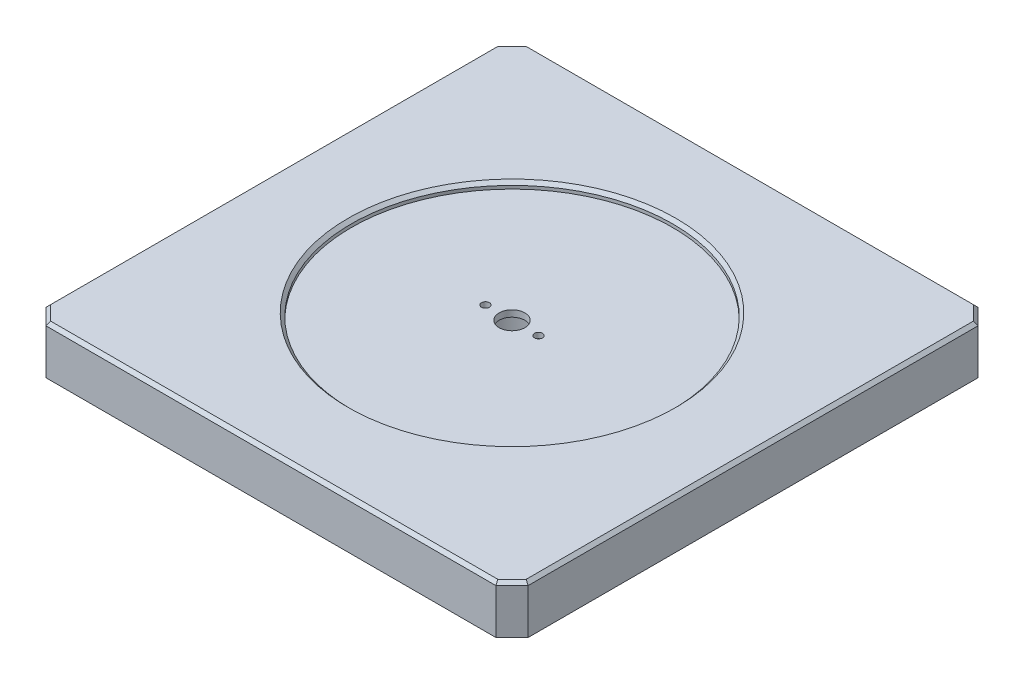
ISO-10303-21;
HEADER;
FILE_DESCRIPTION(('STEP AP214'),'2;1');
FILE_NAME('part.step','',(''),(''),'','','');
FILE_SCHEMA(('AUTOMOTIVE_DESIGN { 1 0 10303 214 1 1 1 1 }'));
ENDSEC;
DATA;
#1=APPLICATION_CONTEXT('core data for automotive mechanical design processes');
#2=APPLICATION_PROTOCOL_DEFINITION('international standard','automotive_design',2000,#1);
#3=PRODUCT_CONTEXT('',#1,'mechanical');
#4=PRODUCT('Part','Part','',(#3));
#5=PRODUCT_RELATED_PRODUCT_CATEGORY('part','',(#4));
#6=PRODUCT_DEFINITION_FORMATION('','',#4);
#7=PRODUCT_DEFINITION_CONTEXT('part definition',#1,'design');
#8=PRODUCT_DEFINITION('design','',#6,#7);
#9=PRODUCT_DEFINITION_SHAPE('','',#8);
#10=(LENGTH_UNIT() NAMED_UNIT(*) SI_UNIT(.MILLI.,.METRE.));
#11=(NAMED_UNIT(*) PLANE_ANGLE_UNIT() SI_UNIT($,.RADIAN.));
#12=(NAMED_UNIT(*) SI_UNIT($,.STERADIAN.) SOLID_ANGLE_UNIT());
#13=UNCERTAINTY_MEASURE_WITH_UNIT(LENGTH_MEASURE(1.E-05),#10,'distance_accuracy_value','');
#14=(GEOMETRIC_REPRESENTATION_CONTEXT(3) GLOBAL_UNCERTAINTY_ASSIGNED_CONTEXT((#13)) GLOBAL_UNIT_ASSIGNED_CONTEXT((#10,
#11,#12)) REPRESENTATION_CONTEXT('',''));
#15=CARTESIAN_POINT('',(0.,0.,0.));
#16=DIRECTION('',(0.,0.,1.));
#17=DIRECTION('',(1.,0.,0.));
#18=AXIS2_PLACEMENT_3D('',#15,#16,#17);
#19=CARTESIAN_POINT('',(0.,15.,0.));
#20=DIRECTION('',(0.,-1.,0.));
#21=DIRECTION('',(0.,0.,-1.));
#22=AXIS2_PLACEMENT_3D('',#19,#20,#21);
#23=CYLINDRICAL_SURFACE('',#22,4.);
#24=CARTESIAN_POINT('',(0.,11.,0.));
#25=DIRECTION('',(0.,-1.,0.));
#26=DIRECTION('',(0.,0.,-1.));
#27=AXIS2_PLACEMENT_3D('',#24,#25,#26);
#28=CIRCLE('',#27,4.);
#29=CARTESIAN_POINT('',(0.,11.,-4.));
#30=VERTEX_POINT('',#29);
#31=EDGE_CURVE('E165',#30,#30,#28,.T.);
#32=ORIENTED_EDGE('',*,*,#31,.T.);
#33=EDGE_LOOP('',(#32));
#34=FACE_BOUND('',#33,.T.);
#35=CARTESIAN_POINT('',(0.,13.,0.));
#36=DIRECTION('',(0.,1.,0.));
#37=DIRECTION('',(0.,0.,1.));
#38=AXIS2_PLACEMENT_3D('',#35,#36,#37);
#39=CIRCLE('',#38,4.);
#40=CARTESIAN_POINT('',(0.,13.,4.));
#41=VERTEX_POINT('',#40);
#42=EDGE_CURVE('E162',#41,#41,#39,.F.);
#43=ORIENTED_EDGE('',*,*,#42,.F.);
#44=EDGE_LOOP('',(#43));
#45=FACE_BOUND('',#44,.T.);
#46=ADVANCED_FACE('F36',(#34,#45),#23,.F.);
#47=CARTESIAN_POINT('',(75.,15.,-75.));
#48=DIRECTION('',(-1.,0.,0.));
#49=DIRECTION('',(0.,0.,1.));
#50=AXIS2_PLACEMENT_3D('',#47,#48,#49);
#51=PLANE('',#50);
#52=DIRECTION('',(0.,1.,0.));
#53=VECTOR('',#52,1.);
#54=CARTESIAN_POINT('',(75.,15.,-70.));
#55=LINE('',#54,#53);
#56=CARTESIAN_POINT('',(75.,0.,-70.));
#57=VERTEX_POINT('',#56);
#58=CARTESIAN_POINT('',(75.,14.0000000000001,-70.));
#59=VERTEX_POINT('',#58);
#60=EDGE_CURVE('E139',#57,#59,#55,.T.);
#61=ORIENTED_EDGE('',*,*,#60,.T.);
#62=DIRECTION('',(0.,0.,1.));
#63=VECTOR('',#62,1.);
#64=CARTESIAN_POINT('',(75.,14.0000000000001,-75.));
#65=LINE('',#64,#63);
#66=CARTESIAN_POINT('',(75.,14.0000000000001,70.));
#67=VERTEX_POINT('',#66);
#68=EDGE_CURVE('E45',#59,#67,#65,.T.);
#69=ORIENTED_EDGE('',*,*,#68,.T.);
#70=DIRECTION('',(0.,-1.,0.));
#71=VECTOR('',#70,1.);
#72=CARTESIAN_POINT('',(75.,15.,70.));
#73=LINE('',#72,#71);
#74=CARTESIAN_POINT('',(75.,0.,70.));
#75=VERTEX_POINT('',#74);
#76=EDGE_CURVE('E143',#67,#75,#73,.T.);
#77=ORIENTED_EDGE('',*,*,#76,.T.);
#78=DIRECTION('',(0.,0.,-1.));
#79=VECTOR('',#78,1.);
#80=CARTESIAN_POINT('',(75.,0.,-75.));
#81=LINE('',#80,#79);
#82=EDGE_CURVE('E150',#75,#57,#81,.T.);
#83=ORIENTED_EDGE('',*,*,#82,.T.);
#84=EDGE_LOOP('',(#61,#69,#77,#83));
#85=FACE_BOUND('',#84,.T.);
#86=ADVANCED_FACE('F295',(#85),#51,.F.);
#87=CARTESIAN_POINT('',(75.,15.,-75.));
#88=DIRECTION('',(0.,0.,1.));
#89=DIRECTION('',(1.,0.,0.));
#90=AXIS2_PLACEMENT_3D('',#87,#88,#89);
#91=PLANE('',#90);
#92=DIRECTION('',(0.,1.,0.));
#93=VECTOR('',#92,1.);
#94=CARTESIAN_POINT('',(-70.,15.,-75.));
#95=LINE('',#94,#93);
#96=CARTESIAN_POINT('',(-70.,0.,-75.));
#97=VERTEX_POINT('',#96);
#98=CARTESIAN_POINT('',(-70.,14.0000000000001,-75.));
#99=VERTEX_POINT('',#98);
#100=EDGE_CURVE('E135',#97,#99,#95,.T.);
#101=ORIENTED_EDGE('',*,*,#100,.T.);
#102=DIRECTION('',(1.,0.,0.));
#103=VECTOR('',#102,1.);
#104=CARTESIAN_POINT('',(75.,14.0000000000001,-75.));
#105=LINE('',#104,#103);
#106=CARTESIAN_POINT('',(70.,14.0000000000001,-75.));
#107=VERTEX_POINT('',#106);
#108=EDGE_CURVE('E61',#99,#107,#105,.T.);
#109=ORIENTED_EDGE('',*,*,#108,.T.);
#110=DIRECTION('',(0.,-1.,0.));
#111=VECTOR('',#110,1.);
#112=CARTESIAN_POINT('',(70.,15.,-75.));
#113=LINE('',#112,#111);
#114=CARTESIAN_POINT('',(70.,0.,-75.));
#115=VERTEX_POINT('',#114);
#116=EDGE_CURVE('E127',#107,#115,#113,.T.);
#117=ORIENTED_EDGE('',*,*,#116,.T.);
#118=DIRECTION('',(-1.,0.,0.));
#119=VECTOR('',#118,1.);
#120=CARTESIAN_POINT('',(75.,0.,-75.));
#121=LINE('',#120,#119);
#122=EDGE_CURVE('E131',#115,#97,#121,.T.);
#123=ORIENTED_EDGE('',*,*,#122,.T.);
#124=EDGE_LOOP('',(#101,#109,#117,#123));
#125=FACE_BOUND('',#124,.T.);
#126=ADVANCED_FACE('F129',(#125),#91,.F.);
#127=CARTESIAN_POINT('',(-75.,15.,-75.));
#128=DIRECTION('',(1.,0.,0.));
#129=DIRECTION('',(0.,0.,-1.));
#130=AXIS2_PLACEMENT_3D('',#127,#128,#129);
#131=PLANE('',#130);
#132=DIRECTION('',(0.,1.,0.));
#133=VECTOR('',#132,1.);
#134=CARTESIAN_POINT('',(-75.,15.,70.));
#135=LINE('',#134,#133);
#136=CARTESIAN_POINT('',(-75.,0.,70.));
#137=VERTEX_POINT('',#136);
#138=CARTESIAN_POINT('',(-75.,14.0000000000001,70.));
#139=VERTEX_POINT('',#138);
#140=EDGE_CURVE('E191',#137,#139,#135,.T.);
#141=ORIENTED_EDGE('',*,*,#140,.T.);
#142=DIRECTION('',(0.,0.,-1.));
#143=VECTOR('',#142,1.);
#144=CARTESIAN_POINT('',(-75.,14.0000000000001,-75.));
#145=LINE('',#144,#143);
#146=CARTESIAN_POINT('',(-75.,14.0000000000001,-70.));
#147=VERTEX_POINT('',#146);
#148=EDGE_CURVE('E221',#139,#147,#145,.T.);
#149=ORIENTED_EDGE('',*,*,#148,.T.);
#150=DIRECTION('',(0.,-1.,0.));
#151=VECTOR('',#150,1.);
#152=CARTESIAN_POINT('',(-75.,15.,-70.));
#153=LINE('',#152,#151);
#154=CARTESIAN_POINT('',(-75.,0.,-70.));
#155=VERTEX_POINT('',#154);
#156=EDGE_CURVE('E189',#147,#155,#153,.T.);
#157=ORIENTED_EDGE('',*,*,#156,.T.);
#158=DIRECTION('',(0.,0.,1.));
#159=VECTOR('',#158,1.);
#160=CARTESIAN_POINT('',(-75.,0.,-75.));
#161=LINE('',#160,#159);
#162=EDGE_CURVE('E149',#155,#137,#161,.T.);
#163=ORIENTED_EDGE('',*,*,#162,.T.);
#164=EDGE_LOOP('',(#141,#149,#157,#163));
#165=FACE_BOUND('',#164,.T.);
#166=ADVANCED_FACE('F419',(#165),#131,.F.);
#167=CARTESIAN_POINT('',(75.,15.,75.));
#168=DIRECTION('',(0.,0.,-1.));
#169=DIRECTION('',(-1.,0.,0.));
#170=AXIS2_PLACEMENT_3D('',#167,#168,#169);
#171=PLANE('',#170);
#172=DIRECTION('',(0.,1.,0.));
#173=VECTOR('',#172,1.);
#174=CARTESIAN_POINT('',(70.,15.,75.));
#175=LINE('',#174,#173);
#176=CARTESIAN_POINT('',(70.,0.,75.));
#177=VERTEX_POINT('',#176);
#178=CARTESIAN_POINT('',(70.,14.0000000000001,75.));
#179=VERTEX_POINT('',#178);
#180=EDGE_CURVE('E186',#177,#179,#175,.T.);
#181=ORIENTED_EDGE('',*,*,#180,.T.);
#182=DIRECTION('',(-1.,0.,0.));
#183=VECTOR('',#182,1.);
#184=CARTESIAN_POINT('',(75.,14.0000000000001,75.));
#185=LINE('',#184,#183);
#186=CARTESIAN_POINT('',(-70.,14.0000000000001,75.));
#187=VERTEX_POINT('',#186);
#188=EDGE_CURVE('E217',#179,#187,#185,.T.);
#189=ORIENTED_EDGE('',*,*,#188,.T.);
#190=DIRECTION('',(0.,-1.,0.));
#191=VECTOR('',#190,1.);
#192=CARTESIAN_POINT('',(-70.,15.,75.));
#193=LINE('',#192,#191);
#194=CARTESIAN_POINT('',(-70.,0.,75.));
#195=VERTEX_POINT('',#194);
#196=EDGE_CURVE('E184',#187,#195,#193,.T.);
#197=ORIENTED_EDGE('',*,*,#196,.T.);
#198=DIRECTION('',(1.,0.,0.));
#199=VECTOR('',#198,1.);
#200=CARTESIAN_POINT('',(75.,0.,75.));
#201=LINE('',#200,#199);
#202=EDGE_CURVE('E153',#195,#177,#201,.T.);
#203=ORIENTED_EDGE('',*,*,#202,.T.);
#204=EDGE_LOOP('',(#181,#189,#197,#203));
#205=FACE_BOUND('',#204,.T.);
#206=ADVANCED_FACE('F290',(#205),#171,.F.);
#207=CARTESIAN_POINT('',(0.,15.,0.));
#208=DIRECTION('',(0.,-1.,0.));
#209=DIRECTION('',(0.,0.,-1.));
#210=AXIS2_PLACEMENT_3D('',#207,#208,#209);
#211=PLANE('',#210);
#212=DIRECTION('',(1.,0.,0.));
#213=VECTOR('',#212,1.);
#214=CARTESIAN_POINT('',(0.,15.,74.));
#215=LINE('',#214,#213);
#216=CARTESIAN_POINT('',(-69.5857864376269,15.,74.));
#217=VERTEX_POINT('',#216);
#218=CARTESIAN_POINT('',(69.5857864376269,15.,74.));
#219=VERTEX_POINT('',#218);
#220=EDGE_CURVE('E209',#217,#219,#215,.T.);
#221=ORIENTED_EDGE('',*,*,#220,.T.);
#222=DIRECTION('',(0.707106781186548,0.,-0.707106781186548));
#223=VECTOR('',#222,1.);
#224=CARTESIAN_POINT('',(74.2928932188135,15.,69.2928932188134));
#225=LINE('',#224,#223);
#226=CARTESIAN_POINT('',(74.0000000000001,15.,69.5857864376269));
#227=VERTEX_POINT('',#226);
#228=EDGE_CURVE('E211',#219,#227,#225,.T.);
#229=ORIENTED_EDGE('',*,*,#228,.T.);
#230=DIRECTION('',(0.,0.,-1.));
#231=VECTOR('',#230,1.);
#232=CARTESIAN_POINT('',(74.0000000000001,15.,0.));
#233=LINE('',#232,#231);
#234=CARTESIAN_POINT('',(74.0000000000001,15.,-69.5857864376269));
#235=VERTEX_POINT('',#234);
#236=EDGE_CURVE('E197',#227,#235,#233,.T.);
#237=ORIENTED_EDGE('',*,*,#236,.T.);
#238=DIRECTION('',(-0.707106781186546,0.,-0.707106781186549));
#239=VECTOR('',#238,1.);
#240=CARTESIAN_POINT('',(69.2928932188135,15.,-74.2928932188135));
#241=LINE('',#240,#239);
#242=CARTESIAN_POINT('',(69.5857864376269,15.,-74.));
#243=VERTEX_POINT('',#242);
#244=EDGE_CURVE('E199',#235,#243,#241,.T.);
#245=ORIENTED_EDGE('',*,*,#244,.T.);
#246=DIRECTION('',(-1.,0.,0.));
#247=VECTOR('',#246,1.);
#248=CARTESIAN_POINT('',(0.,15.,-74.));
#249=LINE('',#248,#247);
#250=CARTESIAN_POINT('',(-69.5857864376269,15.,-74.));
#251=VERTEX_POINT('',#250);
#252=EDGE_CURVE('E201',#243,#251,#249,.T.);
#253=ORIENTED_EDGE('',*,*,#252,.T.);
#254=DIRECTION('',(-0.707106781186549,0.,0.707106781186546));
#255=VECTOR('',#254,1.);
#256=CARTESIAN_POINT('',(-74.2928932188135,15.,-69.2928932188135));
#257=LINE('',#256,#255);
#258=CARTESIAN_POINT('',(-74.,15.,-69.5857864376269));
#259=VERTEX_POINT('',#258);
#260=EDGE_CURVE('E203',#251,#259,#257,.T.);
#261=ORIENTED_EDGE('',*,*,#260,.T.);
#262=DIRECTION('',(0.,0.,1.));
#263=VECTOR('',#262,1.);
#264=CARTESIAN_POINT('',(-74.,15.,0.));
#265=LINE('',#264,#263);
#266=CARTESIAN_POINT('',(-74.,15.,69.5857864376269));
#267=VERTEX_POINT('',#266);
#268=EDGE_CURVE('E205',#259,#267,#265,.T.);
#269=ORIENTED_EDGE('',*,*,#268,.T.);
#270=DIRECTION('',(0.707106781186549,0.,0.707106781186546));
#271=VECTOR('',#270,1.);
#272=CARTESIAN_POINT('',(-69.2928932188135,15.,74.2928932188134));
#273=LINE('',#272,#271);
#274=EDGE_CURVE('E207',#267,#217,#273,.T.);
#275=ORIENTED_EDGE('',*,*,#274,.T.);
#276=EDGE_LOOP('',(#221,#229,#237,#245,#253,#261,#269,#275));
#277=FACE_BOUND('',#276,.T.);
#278=CARTESIAN_POINT('',(0.,15.,0.));
#279=DIRECTION('',(0.,-1.,0.));
#280=DIRECTION('',(0.,0.,-1.));
#281=AXIS2_PLACEMENT_3D('',#278,#279,#280);
#282=CIRCLE('',#281,51.);
#283=CARTESIAN_POINT('',(0.,15.,-51.));
#284=VERTEX_POINT('',#283);
#285=EDGE_CURVE('E194',#284,#284,#282,.T.);
#286=ORIENTED_EDGE('',*,*,#285,.T.);
#287=EDGE_LOOP('',(#286));
#288=FACE_BOUND('',#287,.T.);
#289=ADVANCED_FACE('F281',(#277,#288),#211,.F.);
#290=CARTESIAN_POINT('',(0.,0.,0.));
#291=DIRECTION('',(0.,-1.,0.));
#292=DIRECTION('',(0.,0.,-1.));
#293=AXIS2_PLACEMENT_3D('',#290,#291,#292);
#294=PLANE('',#293);
#295=CARTESIAN_POINT('',(0.,0.,0.));
#296=DIRECTION('',(0.,-1.,0.));
#297=DIRECTION('',(0.,0.,-1.));
#298=AXIS2_PLACEMENT_3D('',#295,#296,#297);
#299=CIRCLE('',#298,12.5);
#300=CARTESIAN_POINT('',(0.,0.,-12.5));
#301=VERTEX_POINT('',#300);
#302=EDGE_CURVE('E271',#301,#301,#299,.T.);
#303=ORIENTED_EDGE('',*,*,#302,.F.);
#304=EDGE_LOOP('',(#303));
#305=FACE_BOUND('',#304,.T.);
#306=ORIENTED_EDGE('',*,*,#122,.F.);
#307=DIRECTION('',(-0.707106781186546,0.,-0.707106781186549));
#308=VECTOR('',#307,1.);
#309=CARTESIAN_POINT('',(72.5000000000002,0.,-72.4999999999998));
#310=LINE('',#309,#308);
#311=EDGE_CURVE('E137',#115,#57,#310,.F.);
#312=ORIENTED_EDGE('',*,*,#311,.T.);
#313=ORIENTED_EDGE('',*,*,#82,.F.);
#314=DIRECTION('',(0.707106781186548,0.,-0.707106781186548));
#315=VECTOR('',#314,1.);
#316=CARTESIAN_POINT('',(72.5,0.,72.5));
#317=LINE('',#316,#315);
#318=EDGE_CURVE('E144',#75,#177,#317,.F.);
#319=ORIENTED_EDGE('',*,*,#318,.T.);
#320=ORIENTED_EDGE('',*,*,#202,.F.);
#321=DIRECTION('',(0.707106781186549,0.,0.707106781186546));
#322=VECTOR('',#321,1.);
#323=CARTESIAN_POINT('',(-72.4999999999998,0.,72.5000000000002));
#324=LINE('',#323,#322);
#325=EDGE_CURVE('E179',#195,#137,#324,.F.);
#326=ORIENTED_EDGE('',*,*,#325,.T.);
#327=ORIENTED_EDGE('',*,*,#162,.F.);
#328=DIRECTION('',(-0.707106781186549,0.,0.707106781186546));
#329=VECTOR('',#328,1.);
#330=CARTESIAN_POINT('',(-72.4999999999998,0.,-72.5000000000002));
#331=LINE('',#330,#329);
#332=EDGE_CURVE('E134',#155,#97,#331,.F.);
#333=ORIENTED_EDGE('',*,*,#332,.T.);
#334=EDGE_LOOP('',(#306,#312,#313,#319,#320,#326,#327,#333));
#335=FACE_BOUND('',#334,.T.);
#336=ADVANCED_FACE('F146',(#305,#335),#294,.T.);
#337=CARTESIAN_POINT('',(0.,11.,0.));
#338=DIRECTION('',(0.,-1.,0.));
#339=DIRECTION('',(0.,0.,-1.));
#340=AXIS2_PLACEMENT_3D('',#337,#338,#339);
#341=CYLINDRICAL_SURFACE('',#340,12.5);
#342=CARTESIAN_POINT('',(0.,11.,0.));
#343=DIRECTION('',(0.,-1.,0.));
#344=DIRECTION('',(0.,0.,-1.));
#345=AXIS2_PLACEMENT_3D('',#342,#343,#344);
#346=CIRCLE('',#345,12.5);
#347=CARTESIAN_POINT('',(0.,11.,-12.5));
#348=VERTEX_POINT('',#347);
#349=EDGE_CURVE('E155',#348,#348,#346,.T.);
#350=ORIENTED_EDGE('',*,*,#349,.F.);
#351=EDGE_LOOP('',(#350));
#352=FACE_BOUND('',#351,.T.);
#353=ORIENTED_EDGE('',*,*,#302,.T.);
#354=EDGE_LOOP('',(#353));
#355=FACE_BOUND('',#354,.T.);
#356=ADVANCED_FACE('F278',(#352,#355),#341,.F.);
#357=CARTESIAN_POINT('',(0.,11.,0.));
#358=DIRECTION('',(0.,-1.,0.));
#359=DIRECTION('',(0.,0.,-1.));
#360=AXIS2_PLACEMENT_3D('',#357,#358,#359);
#361=PLANE('',#360);
#362=CARTESIAN_POINT('',(8.25,11.,0.));
#363=DIRECTION('',(0.,-1.,0.));
#364=DIRECTION('',(0.,0.,-1.));
#365=AXIS2_PLACEMENT_3D('',#362,#363,#364);
#366=CIRCLE('',#365,1.525);
#367=CARTESIAN_POINT('',(8.25,11.,-1.525));
#368=VERTEX_POINT('',#367);
#369=EDGE_CURVE('E249',#368,#368,#366,.T.);
#370=ORIENTED_EDGE('',*,*,#369,.F.);
#371=EDGE_LOOP('',(#370));
#372=FACE_BOUND('',#371,.T.);
#373=CARTESIAN_POINT('',(-8.25,11.,0.));
#374=DIRECTION('',(0.,-1.,0.));
#375=DIRECTION('',(0.,0.,-1.));
#376=AXIS2_PLACEMENT_3D('',#373,#374,#375);
#377=CIRCLE('',#376,1.525);
#378=CARTESIAN_POINT('',(-8.25,11.,-1.525));
#379=VERTEX_POINT('',#378);
#380=EDGE_CURVE('E175',#379,#379,#377,.T.);
#381=ORIENTED_EDGE('',*,*,#380,.F.);
#382=EDGE_LOOP('',(#381));
#383=FACE_BOUND('',#382,.T.);
#384=ORIENTED_EDGE('',*,*,#31,.F.);
#385=EDGE_LOOP('',(#384));
#386=FACE_BOUND('',#385,.T.);
#387=ORIENTED_EDGE('',*,*,#349,.T.);
#388=EDGE_LOOP('',(#387));
#389=FACE_BOUND('',#388,.T.);
#390=ADVANCED_FACE('F287',(#372,#383,#386,#389),#361,.T.);
#391=CARTESIAN_POINT('',(0.,13.,0.));
#392=DIRECTION('',(0.,1.,0.));
#393=DIRECTION('',(0.,0.,1.));
#394=AXIS2_PLACEMENT_3D('',#391,#392,#393);
#395=PLANE('',#394);
#396=CARTESIAN_POINT('',(8.25,13.,0.));
#397=DIRECTION('',(0.,1.,0.));
#398=DIRECTION('',(0.,0.,1.));
#399=AXIS2_PLACEMENT_3D('',#396,#397,#398);
#400=CIRCLE('',#399,1.25);
#401=CARTESIAN_POINT('',(8.25,13.,1.25));
#402=VERTEX_POINT('',#401);
#403=EDGE_CURVE('E172',#402,#402,#400,.T.);
#404=ORIENTED_EDGE('',*,*,#403,.F.);
#405=EDGE_LOOP('',(#404));
#406=FACE_BOUND('',#405,.T.);
#407=CARTESIAN_POINT('',(-8.25,13.,0.));
#408=DIRECTION('',(0.,1.,0.));
#409=DIRECTION('',(0.,0.,1.));
#410=AXIS2_PLACEMENT_3D('',#407,#408,#409);
#411=CIRCLE('',#410,1.25);
#412=CARTESIAN_POINT('',(-8.25,13.,1.25));
#413=VERTEX_POINT('',#412);
#414=EDGE_CURVE('E167',#413,#413,#411,.T.);
#415=ORIENTED_EDGE('',*,*,#414,.F.);
#416=EDGE_LOOP('',(#415));
#417=FACE_BOUND('',#416,.T.);
#418=CARTESIAN_POINT('',(0.,13.,0.));
#419=DIRECTION('',(0.,1.,0.));
#420=DIRECTION('',(0.,0.,1.));
#421=AXIS2_PLACEMENT_3D('',#418,#419,#420);
#422=CIRCLE('',#421,50.);
#423=CARTESIAN_POINT('',(0.,13.,50.));
#424=VERTEX_POINT('',#423);
#425=EDGE_CURVE('E166',#424,#424,#422,.T.);
#426=ORIENTED_EDGE('',*,*,#425,.T.);
#427=EDGE_LOOP('',(#426));
#428=FACE_BOUND('',#427,.T.);
#429=ORIENTED_EDGE('',*,*,#42,.T.);
#430=EDGE_LOOP('',(#429));
#431=FACE_BOUND('',#430,.T.);
#432=ADVANCED_FACE('F309',(#406,#417,#428,#431),#395,.T.);
#433=CARTESIAN_POINT('',(0.,13.,0.));
#434=DIRECTION('',(0.,1.,0.));
#435=DIRECTION('',(0.,0.,1.));
#436=AXIS2_PLACEMENT_3D('',#433,#434,#435);
#437=CYLINDRICAL_SURFACE('',#436,50.);
#438=CARTESIAN_POINT('',(0.,14.,0.));
#439=DIRECTION('',(0.,-1.,0.));
#440=DIRECTION('',(0.,0.,-1.));
#441=AXIS2_PLACEMENT_3D('',#438,#439,#440);
#442=CIRCLE('',#441,50.);
#443=CARTESIAN_POINT('',(0.,14.,-50.));
#444=VERTEX_POINT('',#443);
#445=EDGE_CURVE('E11',#444,#444,#442,.F.);
#446=ORIENTED_EDGE('',*,*,#445,.T.);
#447=EDGE_LOOP('',(#446));
#448=FACE_BOUND('',#447,.T.);
#449=ORIENTED_EDGE('',*,*,#425,.F.);
#450=EDGE_LOOP('',(#449));
#451=FACE_BOUND('',#450,.T.);
#452=ADVANCED_FACE('F306',(#448,#451),#437,.F.);
#453=CARTESIAN_POINT('',(-8.25,11.,0.));
#454=DIRECTION('',(0.,-1.,0.));
#455=DIRECTION('',(0.,0.,-1.));
#456=AXIS2_PLACEMENT_3D('',#453,#454,#455);
#457=CYLINDRICAL_SURFACE('',#456,1.25);
#458=ORIENTED_EDGE('',*,*,#414,.T.);
#459=EDGE_LOOP('',(#458));
#460=FACE_BOUND('',#459,.T.);
#461=CARTESIAN_POINT('',(-8.25,11.275,0.));
#462=DIRECTION('',(0.,-1.,0.));
#463=DIRECTION('',(0.,0.,-1.));
#464=AXIS2_PLACEMENT_3D('',#461,#462,#463);
#465=CIRCLE('',#464,1.25);
#466=CARTESIAN_POINT('',(-8.25,11.275,-1.25));
#467=VERTEX_POINT('',#466);
#468=EDGE_CURVE('E171',#467,#467,#465,.T.);
#469=ORIENTED_EDGE('',*,*,#468,.T.);
#470=EDGE_LOOP('',(#469));
#471=FACE_BOUND('',#470,.T.);
#472=ADVANCED_FACE('F325',(#460,#471),#457,.F.);
#473=CARTESIAN_POINT('',(-8.25,11.,0.));
#474=DIRECTION('',(0.,-1.,0.));
#475=DIRECTION('',(0.,0.,-1.));
#476=AXIS2_PLACEMENT_3D('',#473,#474,#475);
#477=CONICAL_SURFACE('',#476,1.525,0.785398163397448);
#478=ORIENTED_EDGE('',*,*,#468,.F.);
#479=EDGE_LOOP('',(#478));
#480=FACE_BOUND('',#479,.T.);
#481=ORIENTED_EDGE('',*,*,#380,.T.);
#482=EDGE_LOOP('',(#481));
#483=FACE_BOUND('',#482,.T.);
#484=ADVANCED_FACE('F322',(#480,#483),#477,.F.);
#485=CARTESIAN_POINT('',(8.25,11.,0.));
#486=DIRECTION('',(0.,-1.,0.));
#487=DIRECTION('',(0.,0.,-1.));
#488=AXIS2_PLACEMENT_3D('',#485,#486,#487);
#489=CYLINDRICAL_SURFACE('',#488,1.25);
#490=ORIENTED_EDGE('',*,*,#403,.T.);
#491=EDGE_LOOP('',(#490));
#492=FACE_BOUND('',#491,.T.);
#493=CARTESIAN_POINT('',(8.25,11.275,0.));
#494=DIRECTION('',(0.,-1.,0.));
#495=DIRECTION('',(0.,0.,-1.));
#496=AXIS2_PLACEMENT_3D('',#493,#494,#495);
#497=CIRCLE('',#496,1.25);
#498=CARTESIAN_POINT('',(8.25,11.275,-1.25));
#499=VERTEX_POINT('',#498);
#500=EDGE_CURVE('E176',#499,#499,#497,.T.);
#501=ORIENTED_EDGE('',*,*,#500,.T.);
#502=EDGE_LOOP('',(#501));
#503=FACE_BOUND('',#502,.T.);
#504=ADVANCED_FACE('F324',(#492,#503),#489,.F.);
#505=CARTESIAN_POINT('',(8.25,11.,0.));
#506=DIRECTION('',(0.,-1.,0.));
#507=DIRECTION('',(0.,0.,-1.));
#508=AXIS2_PLACEMENT_3D('',#505,#506,#507);
#509=CONICAL_SURFACE('',#508,1.525,0.785398163397448);
#510=ORIENTED_EDGE('',*,*,#500,.F.);
#511=EDGE_LOOP('',(#510));
#512=FACE_BOUND('',#511,.T.);
#513=ORIENTED_EDGE('',*,*,#369,.T.);
#514=EDGE_LOOP('',(#513));
#515=FACE_BOUND('',#514,.T.);
#516=ADVANCED_FACE('F332',(#512,#515),#509,.F.);
#517=CARTESIAN_POINT('',(70.,15.,-75.));
#518=DIRECTION('',(-0.707106781186549,0.,0.707106781186546));
#519=DIRECTION('',(0.,-1.,0.));
#520=AXIS2_PLACEMENT_3D('',#517,#518,#519);
#521=PLANE('',#520);
#522=ORIENTED_EDGE('',*,*,#116,.F.);
#523=DIRECTION('',(-0.707106781186546,0.,-0.707106781186549));
#524=VECTOR('',#523,1.);
#525=CARTESIAN_POINT('',(75.,14.0000000000001,-70.));
#526=LINE('',#525,#524);
#527=EDGE_CURVE('E53',#107,#59,#526,.F.);
#528=ORIENTED_EDGE('',*,*,#527,.T.);
#529=ORIENTED_EDGE('',*,*,#60,.F.);
#530=ORIENTED_EDGE('',*,*,#311,.F.);
#531=EDGE_LOOP('',(#522,#528,#529,#530));
#532=FACE_BOUND('',#531,.T.);
#533=ADVANCED_FACE('F138',(#532),#521,.F.);
#534=CARTESIAN_POINT('',(75.,15.,70.));
#535=DIRECTION('',(-0.707106781186548,0.,-0.707106781186548));
#536=DIRECTION('',(0.,-1.,0.));
#537=AXIS2_PLACEMENT_3D('',#534,#535,#536);
#538=PLANE('',#537);
#539=ORIENTED_EDGE('',*,*,#76,.F.);
#540=DIRECTION('',(0.707106781186548,0.,-0.707106781186548));
#541=VECTOR('',#540,1.);
#542=CARTESIAN_POINT('',(70.,14.0000000000001,75.));
#543=LINE('',#542,#541);
#544=EDGE_CURVE('E214',#67,#179,#543,.F.);
#545=ORIENTED_EDGE('',*,*,#544,.T.);
#546=ORIENTED_EDGE('',*,*,#180,.F.);
#547=ORIENTED_EDGE('',*,*,#318,.F.);
#548=EDGE_LOOP('',(#539,#545,#546,#547));
#549=FACE_BOUND('',#548,.T.);
#550=ADVANCED_FACE('F344',(#549),#538,.F.);
#551=CARTESIAN_POINT('',(-70.,15.,75.));
#552=DIRECTION('',(0.707106781186546,0.,-0.707106781186549));
#553=DIRECTION('',(0.,-1.,0.));
#554=AXIS2_PLACEMENT_3D('',#551,#552,#553);
#555=PLANE('',#554);
#556=ORIENTED_EDGE('',*,*,#196,.F.);
#557=DIRECTION('',(0.707106781186549,0.,0.707106781186546));
#558=VECTOR('',#557,1.);
#559=CARTESIAN_POINT('',(-75.,14.0000000000001,70.));
#560=LINE('',#559,#558);
#561=EDGE_CURVE('E219',#187,#139,#560,.F.);
#562=ORIENTED_EDGE('',*,*,#561,.T.);
#563=ORIENTED_EDGE('',*,*,#140,.F.);
#564=ORIENTED_EDGE('',*,*,#325,.F.);
#565=EDGE_LOOP('',(#556,#562,#563,#564));
#566=FACE_BOUND('',#565,.T.);
#567=ADVANCED_FACE('F351',(#566),#555,.F.);
#568=CARTESIAN_POINT('',(-75.,15.,-70.));
#569=DIRECTION('',(0.707106781186546,0.,0.707106781186549));
#570=DIRECTION('',(0.,-1.,0.));
#571=AXIS2_PLACEMENT_3D('',#568,#569,#570);
#572=PLANE('',#571);
#573=ORIENTED_EDGE('',*,*,#156,.F.);
#574=DIRECTION('',(-0.707106781186549,0.,0.707106781186546));
#575=VECTOR('',#574,1.);
#576=CARTESIAN_POINT('',(-70.,14.0000000000001,-75.));
#577=LINE('',#576,#575);
#578=EDGE_CURVE('E223',#147,#99,#577,.F.);
#579=ORIENTED_EDGE('',*,*,#578,.T.);
#580=ORIENTED_EDGE('',*,*,#100,.F.);
#581=ORIENTED_EDGE('',*,*,#332,.F.);
#582=EDGE_LOOP('',(#573,#579,#580,#581));
#583=FACE_BOUND('',#582,.T.);
#584=ADVANCED_FACE('F358',(#583),#572,.F.);
#585=CARTESIAN_POINT('',(-71.7928932188133,15.,-71.7928932188137));
#586=DIRECTION('',(0.499999999999991,-0.707106781186559,0.499999999999993));
#587=DIRECTION('',(-0.707106781186549,0.,0.707106781186546));
#588=AXIS2_PLACEMENT_3D('',#585,#586,#587);
#589=PLANE('',#588);
#590=DIRECTION('',(0.281084637714821,0.678598344545835,0.678598344545859));
#591=VECTOR('',#590,1.);
#592=CARTESIAN_POINT('',(-64.0879127111899,28.2730413145788,-60.7269586854208));
#593=LINE('',#592,#591);
#594=EDGE_CURVE('E243',#99,#251,#593,.T.);
#595=ORIENTED_EDGE('',*,*,#594,.F.);
#596=ORIENTED_EDGE('',*,*,#578,.F.);
#597=DIRECTION('',(0.678598344545855,0.678598344545836,0.281084637714828));
#598=VECTOR('',#597,1.);
#599=CARTESIAN_POINT('',(-73.4046282150847,15.5953717849153,-69.3391753696607));
#600=LINE('',#599,#598);
#601=EDGE_CURVE('E40',#259,#147,#600,.F.);
#602=ORIENTED_EDGE('',*,*,#601,.F.);
#603=ORIENTED_EDGE('',*,*,#260,.F.);
#604=EDGE_LOOP('',(#595,#596,#602,#603));
#605=FACE_BOUND('',#604,.T.);
#606=ADVANCED_FACE('F362',(#605),#589,.F.);
#607=CARTESIAN_POINT('',(-74.,15.,0.));
#608=DIRECTION('',(0.707106781186538,-0.707106781186557,0.));
#609=DIRECTION('',(0.,0.,1.));
#610=AXIS2_PLACEMENT_3D('',#607,#608,#609);
#611=PLANE('',#610);
#612=ORIENTED_EDGE('',*,*,#601,.T.);
#613=ORIENTED_EDGE('',*,*,#148,.F.);
#614=DIRECTION('',(0.678598344545855,0.678598344545836,-0.281084637714828));
#615=VECTOR('',#614,1.);
#616=CARTESIAN_POINT('',(-60.7269586854205,28.2730413145791,64.0879127111896));
#617=LINE('',#616,#615);
#618=EDGE_CURVE('E241',#267,#139,#617,.F.);
#619=ORIENTED_EDGE('',*,*,#618,.F.);
#620=ORIENTED_EDGE('',*,*,#268,.F.);
#621=EDGE_LOOP('',(#612,#613,#619,#620));
#622=FACE_BOUND('',#621,.T.);
#623=ADVANCED_FACE('F387',(#622),#611,.F.);
#624=CARTESIAN_POINT('',(0.,15.,-74.));
#625=DIRECTION('',(0.,-0.70710678118656,0.707106781186535));
#626=DIRECTION('',(-1.,0.,0.));
#627=AXIS2_PLACEMENT_3D('',#624,#625,#626);
#628=PLANE('',#627);
#629=ORIENTED_EDGE('',*,*,#594,.T.);
#630=ORIENTED_EDGE('',*,*,#252,.F.);
#631=DIRECTION('',(-0.281084637714831,0.678598344545833,0.678598344545857));
#632=VECTOR('',#631,1.);
#633=CARTESIAN_POINT('',(69.3391753696607,15.5953717849153,-73.4046282150847));
#634=LINE('',#633,#632);
#635=EDGE_CURVE('E238',#107,#243,#634,.T.);
#636=ORIENTED_EDGE('',*,*,#635,.F.);
#637=ORIENTED_EDGE('',*,*,#108,.F.);
#638=EDGE_LOOP('',(#629,#630,#636,#637));
#639=FACE_BOUND('',#638,.T.);
#640=ADVANCED_FACE('F383',(#639),#628,.F.);
#641=CARTESIAN_POINT('',(-71.7928932188133,15.,71.7928932188137));
#642=DIRECTION('',(0.499999999999991,-0.707106781186559,-0.499999999999993));
#643=DIRECTION('',(0.707106781186549,0.,0.707106781186546));
#644=AXIS2_PLACEMENT_3D('',#641,#642,#643);
#645=PLANE('',#644);
#646=ORIENTED_EDGE('',*,*,#618,.T.);
#647=ORIENTED_EDGE('',*,*,#561,.F.);
#648=DIRECTION('',(0.281084637714826,0.678598344545836,-0.678598344545855));
#649=VECTOR('',#648,1.);
#650=CARTESIAN_POINT('',(-69.3391753696608,15.5953717849152,73.4046282150848));
#651=LINE('',#650,#649);
#652=EDGE_CURVE('E235',#217,#187,#651,.F.);
#653=ORIENTED_EDGE('',*,*,#652,.F.);
#654=ORIENTED_EDGE('',*,*,#274,.F.);
#655=EDGE_LOOP('',(#646,#647,#653,#654));
#656=FACE_BOUND('',#655,.T.);
#657=ADVANCED_FACE('F379',(#656),#645,.F.);
#658=CARTESIAN_POINT('',(71.7928932188137,15.,-71.7928932188133));
#659=DIRECTION('',(-0.499999999999991,-0.707106781186562,0.499999999999988));
#660=DIRECTION('',(-0.707106781186546,0.,-0.707106781186549));
#661=AXIS2_PLACEMENT_3D('',#658,#659,#660);
#662=PLANE('',#661);
#663=ORIENTED_EDGE('',*,*,#635,.T.);
#664=ORIENTED_EDGE('',*,*,#244,.F.);
#665=DIRECTION('',(-0.678598344545843,0.678598344545838,0.28108463771485));
#666=VECTOR('',#665,1.);
#667=CARTESIAN_POINT('',(60.7269586854197,28.2730413145802,-64.0879127111887));
#668=LINE('',#667,#666);
#669=EDGE_CURVE('E232',#59,#235,#668,.T.);
#670=ORIENTED_EDGE('',*,*,#669,.F.);
#671=ORIENTED_EDGE('',*,*,#527,.F.);
#672=EDGE_LOOP('',(#663,#664,#670,#671));
#673=FACE_BOUND('',#672,.T.);
#674=ADVANCED_FACE('F375',(#673),#662,.F.);
#675=CARTESIAN_POINT('',(0.,15.,74.));
#676=DIRECTION('',(0.,-0.707106781186557,-0.707106781186538));
#677=DIRECTION('',(1.,0.,0.));
#678=AXIS2_PLACEMENT_3D('',#675,#676,#677);
#679=PLANE('',#678);
#680=ORIENTED_EDGE('',*,*,#652,.T.);
#681=ORIENTED_EDGE('',*,*,#188,.F.);
#682=DIRECTION('',(-0.281084637714844,0.678598344545833,-0.678598344545852));
#683=VECTOR('',#682,1.);
#684=CARTESIAN_POINT('',(64.0879127111889,28.2730413145798,60.7269586854198));
#685=LINE('',#684,#683);
#686=EDGE_CURVE('E230',#219,#179,#685,.F.);
#687=ORIENTED_EDGE('',*,*,#686,.F.);
#688=ORIENTED_EDGE('',*,*,#220,.F.);
#689=EDGE_LOOP('',(#680,#681,#687,#688));
#690=FACE_BOUND('',#689,.T.);
#691=ADVANCED_FACE('F371',(#690),#679,.F.);
#692=CARTESIAN_POINT('',(74.0000000000001,15.,0.));
#693=DIRECTION('',(-0.707106781186545,-0.70710678118655,0.));
#694=DIRECTION('',(0.,0.,-1.));
#695=AXIS2_PLACEMENT_3D('',#692,#693,#694);
#696=PLANE('',#695);
#697=ORIENTED_EDGE('',*,*,#669,.T.);
#698=ORIENTED_EDGE('',*,*,#236,.F.);
#699=DIRECTION('',(0.678598344545841,-0.678598344545836,0.28108463771486));
#700=VECTOR('',#699,1.);
#701=CARTESIAN_POINT('',(60.7269586854193,28.2730413145806,64.0879127111883));
#702=LINE('',#701,#700);
#703=EDGE_CURVE('E228',#67,#227,#702,.F.);
#704=ORIENTED_EDGE('',*,*,#703,.F.);
#705=ORIENTED_EDGE('',*,*,#68,.F.);
#706=EDGE_LOOP('',(#697,#698,#704,#705));
#707=FACE_BOUND('',#706,.T.);
#708=ADVANCED_FACE('F367',(#707),#696,.F.);
#709=CARTESIAN_POINT('',(71.7928932188135,15.,71.7928932188135));
#710=DIRECTION('',(-0.499999999999987,-0.707106781186566,-0.499999999999987));
#711=DIRECTION('',(0.707106781186548,0.,-0.707106781186548));
#712=AXIS2_PLACEMENT_3D('',#709,#710,#711);
#713=PLANE('',#712);
#714=ORIENTED_EDGE('',*,*,#686,.T.);
#715=ORIENTED_EDGE('',*,*,#544,.F.);
#716=ORIENTED_EDGE('',*,*,#703,.T.);
#717=ORIENTED_EDGE('',*,*,#228,.F.);
#718=EDGE_LOOP('',(#714,#715,#716,#717));
#719=FACE_BOUND('',#718,.T.);
#720=ADVANCED_FACE('F364',(#719),#713,.F.);
#721=CARTESIAN_POINT('',(0.,14.,0.));
#722=DIRECTION('',(0.,1.,0.));
#723=DIRECTION('',(0.,0.,1.));
#724=AXIS2_PLACEMENT_3D('',#721,#722,#723);
#725=CONICAL_SURFACE('',#724,50.,0.785398163397445);
#726=ORIENTED_EDGE('',*,*,#285,.F.);
#727=EDGE_LOOP('',(#726));
#728=FACE_BOUND('',#727,.T.);
#729=ORIENTED_EDGE('',*,*,#445,.F.);
#730=EDGE_LOOP('',(#729));
#731=FACE_BOUND('',#730,.T.);
#732=ADVANCED_FACE('F38',(#728,#731),#725,.F.);
#733=CLOSED_SHELL('',(#46,#86,#126,#166,#206,#289,#336,#356,#390,#432,#452,#472,#484,#504,#516,
#533,#550,#567,#584,#606,#623,#640,#657,#674,#691,#708,#720,#732));
#734=MANIFOLD_SOLID_BREP('B2',#733);
#735=ADVANCED_BREP_SHAPE_REPRESENTATION('',(#18,#734),#14);
#736=SHAPE_DEFINITION_REPRESENTATION(#9,#735);
ENDSEC;
END-ISO-10303-21;
